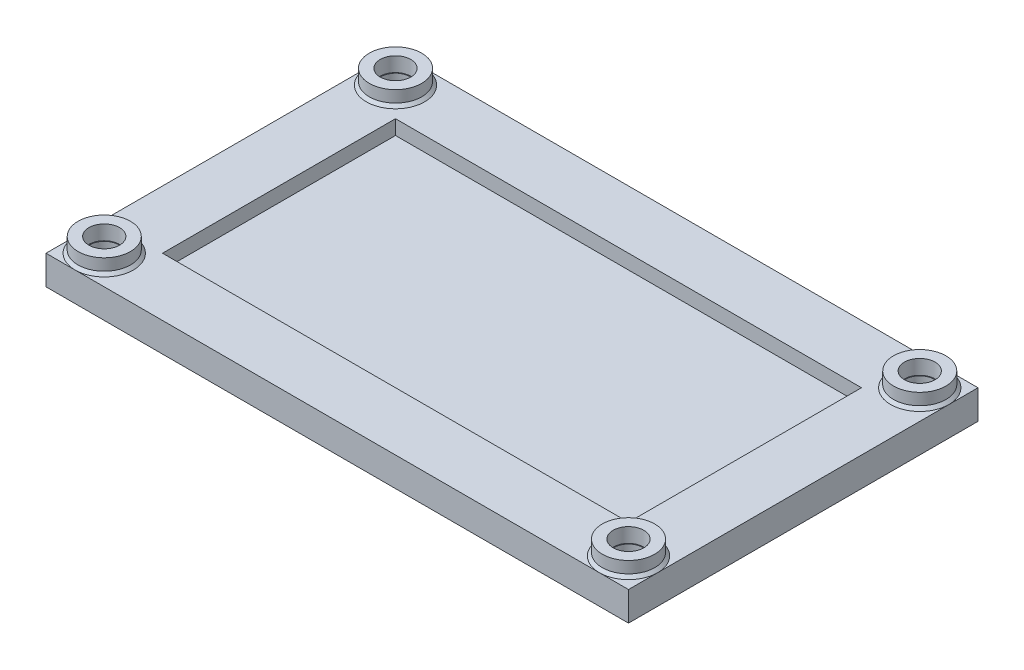
ISO-10303-21;
HEADER;
FILE_DESCRIPTION(('STEP AP214'),'2;1');
FILE_NAME('part.step','',(''),(''),'','','');
FILE_SCHEMA(('AUTOMOTIVE_DESIGN { 1 0 10303 214 1 1 1 1 }'));
ENDSEC;
DATA;
#1=APPLICATION_CONTEXT('core data for automotive mechanical design processes');
#2=APPLICATION_PROTOCOL_DEFINITION('international standard','automotive_design',2000,#1);
#3=PRODUCT_CONTEXT('',#1,'mechanical');
#4=PRODUCT('Part','Part','',(#3));
#5=PRODUCT_RELATED_PRODUCT_CATEGORY('part','',(#4));
#6=PRODUCT_DEFINITION_FORMATION('','',#4);
#7=PRODUCT_DEFINITION_CONTEXT('part definition',#1,'design');
#8=PRODUCT_DEFINITION('design','',#6,#7);
#9=PRODUCT_DEFINITION_SHAPE('','',#8);
#10=(LENGTH_UNIT() NAMED_UNIT(*) SI_UNIT(.MILLI.,.METRE.));
#11=(NAMED_UNIT(*) PLANE_ANGLE_UNIT() SI_UNIT($,.RADIAN.));
#12=(NAMED_UNIT(*) SI_UNIT($,.STERADIAN.) SOLID_ANGLE_UNIT());
#13=UNCERTAINTY_MEASURE_WITH_UNIT(LENGTH_MEASURE(1.E-05),#10,'distance_accuracy_value','');
#14=(GEOMETRIC_REPRESENTATION_CONTEXT(3) GLOBAL_UNCERTAINTY_ASSIGNED_CONTEXT((#13)) GLOBAL_UNIT_ASSIGNED_CONTEXT((#10,
#11,#12)) REPRESENTATION_CONTEXT('',''));
#15=CARTESIAN_POINT('',(0.,0.,0.));
#16=DIRECTION('',(0.,0.,1.));
#17=DIRECTION('',(1.,0.,0.));
#18=AXIS2_PLACEMENT_3D('',#15,#16,#17);
#19=CARTESIAN_POINT('',(0.,10.,0.));
#20=DIRECTION('',(0.,1.,0.));
#21=DIRECTION('',(0.,0.,1.));
#22=AXIS2_PLACEMENT_3D('',#19,#20,#21);
#23=PLANE('',#22);
#24=DIRECTION('',(-1.,0.,0.));
#25=VECTOR('',#24,1.);
#26=CARTESIAN_POINT('',(100.,10.,-60.));
#27=LINE('',#26,#25);
#28=CARTESIAN_POINT('',(100.,10.,-60.));
#29=VERTEX_POINT('',#28);
#30=CARTESIAN_POINT('',(90.,10.,-60.));
#31=VERTEX_POINT('',#30);
#32=EDGE_CURVE('E195',#29,#31,#27,.T.);
#33=ORIENTED_EDGE('',*,*,#32,.T.);
#34=CARTESIAN_POINT('',(90.,10.,-50.));
#35=DIRECTION('',(0.,1.,0.));
#36=DIRECTION('',(0.,0.,1.));
#37=AXIS2_PLACEMENT_3D('',#34,#35,#36);
#38=CIRCLE('',#37,10.);
#39=CARTESIAN_POINT('',(100.,10.,-50.));
#40=VERTEX_POINT('',#39);
#41=EDGE_CURVE('E248',#31,#40,#38,.F.);
#42=ORIENTED_EDGE('',*,*,#41,.T.);
#43=DIRECTION('',(0.,0.,-1.));
#44=VECTOR('',#43,1.);
#45=CARTESIAN_POINT('',(100.,10.,60.));
#46=LINE('',#45,#44);
#47=EDGE_CURVE('E188',#40,#29,#46,.T.);
#48=ORIENTED_EDGE('',*,*,#47,.T.);
#49=EDGE_LOOP('',(#33,#42,#48));
#50=FACE_BOUND('',#49,.T.);
#51=ADVANCED_FACE('F41',(#50),#23,.T.);
#52=DIRECTION('',(0.,0.,1.));
#53=VECTOR('',#52,1.);
#54=CARTESIAN_POINT('',(-100.,10.,60.));
#55=LINE('',#54,#53);
#56=CARTESIAN_POINT('',(-100.,10.,-60.));
#57=VERTEX_POINT('',#56);
#58=CARTESIAN_POINT('',(-100.,10.,-50.));
#59=VERTEX_POINT('',#58);
#60=EDGE_CURVE('E179',#57,#59,#55,.T.);
#61=ORIENTED_EDGE('',*,*,#60,.T.);
#62=CARTESIAN_POINT('',(-90.,10.,-50.));
#63=DIRECTION('',(0.,1.,0.));
#64=DIRECTION('',(0.,0.,1.));
#65=AXIS2_PLACEMENT_3D('',#62,#63,#64);
#66=CIRCLE('',#65,10.);
#67=CARTESIAN_POINT('',(-90.,10.,-60.));
#68=VERTEX_POINT('',#67);
#69=EDGE_CURVE('E245',#59,#68,#66,.F.);
#70=ORIENTED_EDGE('',*,*,#69,.T.);
#71=EDGE_CURVE('E193',#68,#57,#27,.T.);
#72=ORIENTED_EDGE('',*,*,#71,.T.);
#73=EDGE_LOOP('',(#61,#70,#72));
#74=FACE_BOUND('',#73,.T.);
#75=ADVANCED_FACE('F273',(#74),#23,.T.);
#76=DIRECTION('',(1.,0.,0.));
#77=VECTOR('',#76,1.);
#78=CARTESIAN_POINT('',(100.,10.,60.));
#79=LINE('',#78,#77);
#80=CARTESIAN_POINT('',(-100.,10.,60.));
#81=VERTEX_POINT('',#80);
#82=CARTESIAN_POINT('',(-90.,10.,60.));
#83=VERTEX_POINT('',#82);
#84=EDGE_CURVE('E185',#81,#83,#79,.T.);
#85=ORIENTED_EDGE('',*,*,#84,.T.);
#86=CARTESIAN_POINT('',(-90.,10.,50.));
#87=DIRECTION('',(0.,1.,0.));
#88=DIRECTION('',(0.,0.,1.));
#89=AXIS2_PLACEMENT_3D('',#86,#87,#88);
#90=CIRCLE('',#89,10.);
#91=CARTESIAN_POINT('',(-100.,10.,50.));
#92=VERTEX_POINT('',#91);
#93=EDGE_CURVE('E241',#83,#92,#90,.F.);
#94=ORIENTED_EDGE('',*,*,#93,.T.);
#95=EDGE_CURVE('E184',#92,#81,#55,.T.);
#96=ORIENTED_EDGE('',*,*,#95,.T.);
#97=EDGE_LOOP('',(#85,#94,#96));
#98=FACE_BOUND('',#97,.T.);
#99=ADVANCED_FACE('F280',(#98),#23,.T.);
#100=DIRECTION('',(0.,0.,-1.));
#101=VECTOR('',#100,1.);
#102=CARTESIAN_POINT('',(80.,10.,-40.));
#103=LINE('',#102,#101);
#104=CARTESIAN_POINT('',(80.,10.,40.));
#105=VERTEX_POINT('',#104);
#106=CARTESIAN_POINT('',(80.,10.,-40.));
#107=VERTEX_POINT('',#106);
#108=EDGE_CURVE('E139',#105,#107,#103,.T.);
#109=ORIENTED_EDGE('',*,*,#108,.F.);
#110=DIRECTION('',(1.,0.,0.));
#111=VECTOR('',#110,1.);
#112=CARTESIAN_POINT('',(-80.,10.,40.));
#113=LINE('',#112,#111);
#114=CARTESIAN_POINT('',(-80.,10.,40.));
#115=VERTEX_POINT('',#114);
#116=EDGE_CURVE('E156',#115,#105,#113,.T.);
#117=ORIENTED_EDGE('',*,*,#116,.F.);
#118=DIRECTION('',(0.,0.,1.));
#119=VECTOR('',#118,1.);
#120=CARTESIAN_POINT('',(-80.,10.,-40.));
#121=LINE('',#120,#119);
#122=CARTESIAN_POINT('',(-80.,10.,-40.));
#123=VERTEX_POINT('',#122);
#124=EDGE_CURVE('E159',#123,#115,#121,.T.);
#125=ORIENTED_EDGE('',*,*,#124,.F.);
#126=DIRECTION('',(-1.,0.,0.));
#127=VECTOR('',#126,1.);
#128=CARTESIAN_POINT('',(-80.,10.,-40.));
#129=LINE('',#128,#127);
#130=EDGE_CURVE('E168',#107,#123,#129,.T.);
#131=ORIENTED_EDGE('',*,*,#130,.F.);
#132=EDGE_LOOP('',(#109,#117,#125,#131));
#133=FACE_BOUND('',#132,.T.);
#134=CARTESIAN_POINT('',(100.,10.,50.));
#135=VERTEX_POINT('',#134);
#136=EDGE_CURVE('E194',#135,#40,#46,.T.);
#137=ORIENTED_EDGE('',*,*,#136,.T.);
#138=CARTESIAN_POINT('',(90.,10.,-50.));
#139=DIRECTION('',(0.,1.,0.));
#140=DIRECTION('',(0.,0.,1.));
#141=AXIS2_PLACEMENT_3D('',#138,#139,#140);
#142=CIRCLE('',#141,10.);
#143=EDGE_CURVE('E64',#40,#31,#142,.F.);
#144=ORIENTED_EDGE('',*,*,#143,.T.);
#145=EDGE_CURVE('E199',#31,#68,#27,.T.);
#146=ORIENTED_EDGE('',*,*,#145,.T.);
#147=CARTESIAN_POINT('',(-90.,10.,-50.));
#148=DIRECTION('',(0.,1.,0.));
#149=DIRECTION('',(0.,0.,1.));
#150=AXIS2_PLACEMENT_3D('',#147,#148,#149);
#151=CIRCLE('',#150,10.);
#152=EDGE_CURVE('E56',#68,#59,#151,.F.);
#153=ORIENTED_EDGE('',*,*,#152,.T.);
#154=EDGE_CURVE('E183',#59,#92,#55,.T.);
#155=ORIENTED_EDGE('',*,*,#154,.T.);
#156=CARTESIAN_POINT('',(-90.,10.,50.));
#157=DIRECTION('',(0.,1.,0.));
#158=DIRECTION('',(0.,0.,1.));
#159=AXIS2_PLACEMENT_3D('',#156,#157,#158);
#160=CIRCLE('',#159,10.);
#161=EDGE_CURVE('E239',#92,#83,#160,.F.);
#162=ORIENTED_EDGE('',*,*,#161,.T.);
#163=CARTESIAN_POINT('',(90.,10.,60.));
#164=VERTEX_POINT('',#163);
#165=EDGE_CURVE('E189',#83,#164,#79,.T.);
#166=ORIENTED_EDGE('',*,*,#165,.T.);
#167=CARTESIAN_POINT('',(90.,10.,50.));
#168=DIRECTION('',(0.,1.,0.));
#169=DIRECTION('',(0.,0.,1.));
#170=AXIS2_PLACEMENT_3D('',#167,#168,#169);
#171=CIRCLE('',#170,10.);
#172=EDGE_CURVE('E236',#164,#135,#171,.F.);
#173=ORIENTED_EDGE('',*,*,#172,.T.);
#174=EDGE_LOOP('',(#137,#144,#146,#153,#155,#162,#166,#173));
#175=FACE_BOUND('',#174,.T.);
#176=ADVANCED_FACE('F286',(#133,#175),#23,.T.);
#177=CARTESIAN_POINT('',(100.,10.,60.));
#178=VERTEX_POINT('',#177);
#179=EDGE_CURVE('E190',#178,#135,#46,.T.);
#180=ORIENTED_EDGE('',*,*,#179,.T.);
#181=CARTESIAN_POINT('',(90.,10.,50.));
#182=DIRECTION('',(0.,1.,0.));
#183=DIRECTION('',(0.,0.,1.));
#184=AXIS2_PLACEMENT_3D('',#181,#182,#183);
#185=CIRCLE('',#184,10.);
#186=EDGE_CURVE('E234',#135,#164,#185,.F.);
#187=ORIENTED_EDGE('',*,*,#186,.T.);
#188=EDGE_CURVE('E182',#164,#178,#79,.T.);
#189=ORIENTED_EDGE('',*,*,#188,.T.);
#190=EDGE_LOOP('',(#180,#187,#189));
#191=FACE_BOUND('',#190,.T.);
#192=ADVANCED_FACE('F276',(#191),#23,.T.);
#193=CARTESIAN_POINT('',(-90.,10.,-50.));
#194=DIRECTION('',(0.,1.,0.));
#195=DIRECTION('',(0.,0.,1.));
#196=AXIS2_PLACEMENT_3D('',#193,#194,#195);
#197=CIRCLE('',#196,5.00000000000001);
#198=CARTESIAN_POINT('',(-90.,10.,-45.));
#199=VERTEX_POINT('',#198);
#200=EDGE_CURVE('E169',#199,#199,#197,.T.);
#201=ORIENTED_EDGE('',*,*,#200,.F.);
#202=EDGE_LOOP('',(#201));
#203=FACE_BOUND('',#202,.T.);
#204=CARTESIAN_POINT('',(-90.,10.,-50.));
#205=DIRECTION('',(0.,1.,0.));
#206=DIRECTION('',(0.,0.,1.));
#207=AXIS2_PLACEMENT_3D('',#204,#205,#206);
#208=CIRCLE('',#207,5.25);
#209=CARTESIAN_POINT('',(-90.,10.,-44.75));
#210=VERTEX_POINT('',#209);
#211=EDGE_CURVE('E219',#210,#210,#208,.F.);
#212=ORIENTED_EDGE('',*,*,#211,.F.);
#213=EDGE_LOOP('',(#212));
#214=FACE_BOUND('',#213,.T.);
#215=ADVANCED_FACE('F285',(#203,#214),#23,.T.);
#216=CARTESIAN_POINT('',(-90.,5.,-50.));
#217=DIRECTION('',(0.,1.,0.));
#218=DIRECTION('',(0.,0.,1.));
#219=AXIS2_PLACEMENT_3D('',#216,#217,#218);
#220=CYLINDRICAL_SURFACE('',#219,5.00000000000001);
#221=CARTESIAN_POINT('',(-90.,5.,-50.));
#222=DIRECTION('',(0.,1.,0.));
#223=DIRECTION('',(0.,0.,1.));
#224=AXIS2_PLACEMENT_3D('',#221,#222,#223);
#225=CIRCLE('',#224,5.00000000000001);
#226=CARTESIAN_POINT('',(-90.,5.,-45.));
#227=VERTEX_POINT('',#226);
#228=EDGE_CURVE('E399',#227,#227,#225,.T.);
#229=ORIENTED_EDGE('',*,*,#228,.F.);
#230=EDGE_LOOP('',(#229));
#231=FACE_BOUND('',#230,.T.);
#232=ORIENTED_EDGE('',*,*,#200,.T.);
#233=EDGE_LOOP('',(#232));
#234=FACE_BOUND('',#233,.T.);
#235=ADVANCED_FACE('F292',(#231,#234),#220,.F.);
#236=CARTESIAN_POINT('',(-90.,5.,-50.));
#237=DIRECTION('',(0.,1.,0.));
#238=DIRECTION('',(0.,0.,1.));
#239=AXIS2_PLACEMENT_3D('',#236,#237,#238);
#240=PLANE('',#239);
#241=ORIENTED_EDGE('',*,*,#228,.T.);
#242=EDGE_LOOP('',(#241));
#243=FACE_BOUND('',#242,.T.);
#244=ADVANCED_FACE('F540',(#243),#240,.T.);
#245=CARTESIAN_POINT('',(-90.,15.,-50.));
#246=DIRECTION('',(0.,-1.,0.));
#247=DIRECTION('',(0.,0.,-1.));
#248=AXIS2_PLACEMENT_3D('',#245,#246,#247);
#249=CYLINDRICAL_SURFACE('',#248,5.25);
#250=ORIENTED_EDGE('',*,*,#211,.T.);
#251=EDGE_LOOP('',(#250));
#252=FACE_BOUND('',#251,.T.);
#253=CARTESIAN_POINT('',(-90.,15.,-50.));
#254=DIRECTION('',(0.,1.,0.));
#255=DIRECTION('',(0.,0.,1.));
#256=AXIS2_PLACEMENT_3D('',#253,#254,#255);
#257=CIRCLE('',#256,5.25);
#258=CARTESIAN_POINT('',(-90.,15.,-44.75));
#259=VERTEX_POINT('',#258);
#260=EDGE_CURVE('E385',#259,#259,#257,.T.);
#261=ORIENTED_EDGE('',*,*,#260,.T.);
#262=EDGE_LOOP('',(#261));
#263=FACE_BOUND('',#262,.T.);
#264=ADVANCED_FACE('F536',(#252,#263),#249,.F.);
#265=CARTESIAN_POINT('',(-90.,15.,-50.));
#266=DIRECTION('',(0.,-1.,0.));
#267=DIRECTION('',(0.,0.,-1.));
#268=AXIS2_PLACEMENT_3D('',#265,#266,#267);
#269=CYLINDRICAL_SURFACE('',#268,9.00000000000001);
#270=CARTESIAN_POINT('',(-90.,11.,-50.));
#271=DIRECTION('',(0.,1.,0.));
#272=DIRECTION('',(0.,0.,1.));
#273=AXIS2_PLACEMENT_3D('',#270,#271,#272);
#274=CIRCLE('',#273,9.00000000000001);
#275=CARTESIAN_POINT('',(-90.,11.,-41.));
#276=VERTEX_POINT('',#275);
#277=EDGE_CURVE('E251',#276,#276,#274,.T.);
#278=ORIENTED_EDGE('',*,*,#277,.T.);
#279=EDGE_LOOP('',(#278));
#280=FACE_BOUND('',#279,.T.);
#281=CARTESIAN_POINT('',(-90.,15.,-50.));
#282=DIRECTION('',(0.,1.,0.));
#283=DIRECTION('',(0.,0.,1.));
#284=AXIS2_PLACEMENT_3D('',#281,#282,#283);
#285=CIRCLE('',#284,9.00000000000001);
#286=CARTESIAN_POINT('',(-90.,15.,-41.));
#287=VERTEX_POINT('',#286);
#288=EDGE_CURVE('E394',#287,#287,#285,.T.);
#289=ORIENTED_EDGE('',*,*,#288,.F.);
#290=EDGE_LOOP('',(#289));
#291=FACE_BOUND('',#290,.T.);
#292=ADVANCED_FACE('F339',(#280,#291),#269,.T.);
#293=CARTESIAN_POINT('',(0.,15.,0.));
#294=DIRECTION('',(0.,1.,0.));
#295=DIRECTION('',(0.,0.,1.));
#296=AXIS2_PLACEMENT_3D('',#293,#294,#295);
#297=PLANE('',#296);
#298=ORIENTED_EDGE('',*,*,#260,.F.);
#299=EDGE_LOOP('',(#298));
#300=FACE_BOUND('',#299,.T.);
#301=ORIENTED_EDGE('',*,*,#288,.T.);
#302=EDGE_LOOP('',(#301));
#303=FACE_BOUND('',#302,.T.);
#304=ADVANCED_FACE('F333',(#300,#303),#297,.T.);
#305=CARTESIAN_POINT('',(0.,0.,0.));
#306=DIRECTION('',(0.,1.,0.));
#307=DIRECTION('',(0.,0.,1.));
#308=AXIS2_PLACEMENT_3D('',#305,#306,#307);
#309=PLANE('',#308);
#310=DIRECTION('',(0.,0.,1.));
#311=VECTOR('',#310,1.);
#312=CARTESIAN_POINT('',(-100.,0.,60.));
#313=LINE('',#312,#311);
#314=CARTESIAN_POINT('',(-100.,0.,-60.));
#315=VERTEX_POINT('',#314);
#316=CARTESIAN_POINT('',(-100.,0.,60.));
#317=VERTEX_POINT('',#316);
#318=EDGE_CURVE('E175',#315,#317,#313,.T.);
#319=ORIENTED_EDGE('',*,*,#318,.F.);
#320=DIRECTION('',(-1.,0.,0.));
#321=VECTOR('',#320,1.);
#322=CARTESIAN_POINT('',(100.,0.,-60.));
#323=LINE('',#322,#321);
#324=CARTESIAN_POINT('',(100.,0.,-60.));
#325=VERTEX_POINT('',#324);
#326=EDGE_CURVE('E206',#325,#315,#323,.T.);
#327=ORIENTED_EDGE('',*,*,#326,.F.);
#328=DIRECTION('',(0.,0.,-1.));
#329=VECTOR('',#328,1.);
#330=CARTESIAN_POINT('',(100.,0.,60.));
#331=LINE('',#330,#329);
#332=CARTESIAN_POINT('',(100.,0.,60.));
#333=VERTEX_POINT('',#332);
#334=EDGE_CURVE('E204',#333,#325,#331,.T.);
#335=ORIENTED_EDGE('',*,*,#334,.F.);
#336=DIRECTION('',(1.,0.,0.));
#337=VECTOR('',#336,1.);
#338=CARTESIAN_POINT('',(100.,0.,60.));
#339=LINE('',#338,#337);
#340=EDGE_CURVE('E202',#317,#333,#339,.T.);
#341=ORIENTED_EDGE('',*,*,#340,.F.);
#342=EDGE_LOOP('',(#319,#327,#335,#341));
#343=FACE_BOUND('',#342,.T.);
#344=ADVANCED_FACE('F329',(#343),#309,.F.);
#345=CARTESIAN_POINT('',(0.,5.,0.));
#346=DIRECTION('',(0.,1.,0.));
#347=DIRECTION('',(0.,0.,1.));
#348=AXIS2_PLACEMENT_3D('',#345,#346,#347);
#349=PLANE('',#348);
#350=DIRECTION('',(0.,0.,-1.));
#351=VECTOR('',#350,1.);
#352=CARTESIAN_POINT('',(80.,5.,-40.));
#353=LINE('',#352,#351);
#354=CARTESIAN_POINT('',(80.,5.,40.));
#355=VERTEX_POINT('',#354);
#356=CARTESIAN_POINT('',(80.,5.,-40.));
#357=VERTEX_POINT('',#356);
#358=EDGE_CURVE('E136',#355,#357,#353,.T.);
#359=ORIENTED_EDGE('',*,*,#358,.T.);
#360=DIRECTION('',(-1.,0.,0.));
#361=VECTOR('',#360,1.);
#362=CARTESIAN_POINT('',(-80.,5.,-40.));
#363=LINE('',#362,#361);
#364=CARTESIAN_POINT('',(-80.,5.,-40.));
#365=VERTEX_POINT('',#364);
#366=EDGE_CURVE('E147',#357,#365,#363,.T.);
#367=ORIENTED_EDGE('',*,*,#366,.T.);
#368=DIRECTION('',(0.,0.,1.));
#369=VECTOR('',#368,1.);
#370=CARTESIAN_POINT('',(-80.,5.,-40.));
#371=LINE('',#370,#369);
#372=CARTESIAN_POINT('',(-80.,5.,40.));
#373=VERTEX_POINT('',#372);
#374=EDGE_CURVE('E152',#365,#373,#371,.T.);
#375=ORIENTED_EDGE('',*,*,#374,.T.);
#376=DIRECTION('',(1.,0.,0.));
#377=VECTOR('',#376,1.);
#378=CARTESIAN_POINT('',(-80.,5.,40.));
#379=LINE('',#378,#377);
#380=EDGE_CURVE('E144',#373,#355,#379,.T.);
#381=ORIENTED_EDGE('',*,*,#380,.T.);
#382=EDGE_LOOP('',(#359,#367,#375,#381));
#383=FACE_BOUND('',#382,.T.);
#384=ADVANCED_FACE('F154',(#383),#349,.T.);
#385=CARTESIAN_POINT('',(100.,10.,-60.));
#386=DIRECTION('',(0.,0.,1.));
#387=DIRECTION('',(1.,0.,0.));
#388=AXIS2_PLACEMENT_3D('',#385,#386,#387);
#389=PLANE('',#388);
#390=ORIENTED_EDGE('',*,*,#326,.T.);
#391=DIRECTION('',(0.,-1.,0.));
#392=VECTOR('',#391,1.);
#393=CARTESIAN_POINT('',(-100.,10.,-60.));
#394=LINE('',#393,#392);
#395=EDGE_CURVE('E198',#57,#315,#394,.T.);
#396=ORIENTED_EDGE('',*,*,#395,.F.);
#397=ORIENTED_EDGE('',*,*,#71,.F.);
#398=ORIENTED_EDGE('',*,*,#145,.F.);
#399=ORIENTED_EDGE('',*,*,#32,.F.);
#400=DIRECTION('',(0.,-1.,0.));
#401=VECTOR('',#400,1.);
#402=CARTESIAN_POINT('',(100.,10.,-60.));
#403=LINE('',#402,#401);
#404=EDGE_CURVE('E210',#29,#325,#403,.T.);
#405=ORIENTED_EDGE('',*,*,#404,.T.);
#406=EDGE_LOOP('',(#390,#396,#397,#398,#399,#405));
#407=FACE_BOUND('',#406,.T.);
#408=ADVANCED_FACE('F310',(#407),#389,.F.);
#409=CARTESIAN_POINT('',(100.,10.,60.));
#410=DIRECTION('',(-1.,0.,0.));
#411=DIRECTION('',(0.,0.,1.));
#412=AXIS2_PLACEMENT_3D('',#409,#410,#411);
#413=PLANE('',#412);
#414=ORIENTED_EDGE('',*,*,#334,.T.);
#415=ORIENTED_EDGE('',*,*,#404,.F.);
#416=ORIENTED_EDGE('',*,*,#47,.F.);
#417=ORIENTED_EDGE('',*,*,#136,.F.);
#418=ORIENTED_EDGE('',*,*,#179,.F.);
#419=DIRECTION('',(0.,-1.,0.));
#420=VECTOR('',#419,1.);
#421=CARTESIAN_POINT('',(100.,10.,60.));
#422=LINE('',#421,#420);
#423=EDGE_CURVE('E213',#178,#333,#422,.T.);
#424=ORIENTED_EDGE('',*,*,#423,.T.);
#425=EDGE_LOOP('',(#414,#415,#416,#417,#418,#424));
#426=FACE_BOUND('',#425,.T.);
#427=ADVANCED_FACE('F302',(#426),#413,.F.);
#428=CARTESIAN_POINT('',(100.,10.,60.));
#429=DIRECTION('',(0.,0.,-1.));
#430=DIRECTION('',(-1.,0.,0.));
#431=AXIS2_PLACEMENT_3D('',#428,#429,#430);
#432=PLANE('',#431);
#433=ORIENTED_EDGE('',*,*,#340,.T.);
#434=ORIENTED_EDGE('',*,*,#423,.F.);
#435=ORIENTED_EDGE('',*,*,#188,.F.);
#436=ORIENTED_EDGE('',*,*,#165,.F.);
#437=ORIENTED_EDGE('',*,*,#84,.F.);
#438=DIRECTION('',(0.,-1.,0.));
#439=VECTOR('',#438,1.);
#440=CARTESIAN_POINT('',(-100.,10.,60.));
#441=LINE('',#440,#439);
#442=EDGE_CURVE('E216',#81,#317,#441,.T.);
#443=ORIENTED_EDGE('',*,*,#442,.T.);
#444=EDGE_LOOP('',(#433,#434,#435,#436,#437,#443));
#445=FACE_BOUND('',#444,.T.);
#446=ADVANCED_FACE('F326',(#445),#432,.F.);
#447=CARTESIAN_POINT('',(-100.,10.,60.));
#448=DIRECTION('',(1.,0.,0.));
#449=DIRECTION('',(0.,0.,-1.));
#450=AXIS2_PLACEMENT_3D('',#447,#448,#449);
#451=PLANE('',#450);
#452=ORIENTED_EDGE('',*,*,#318,.T.);
#453=ORIENTED_EDGE('',*,*,#442,.F.);
#454=ORIENTED_EDGE('',*,*,#95,.F.);
#455=ORIENTED_EDGE('',*,*,#154,.F.);
#456=ORIENTED_EDGE('',*,*,#60,.F.);
#457=ORIENTED_EDGE('',*,*,#395,.T.);
#458=EDGE_LOOP('',(#452,#453,#454,#455,#456,#457));
#459=FACE_BOUND('',#458,.T.);
#460=ADVANCED_FACE('F317',(#459),#451,.F.);
#461=CARTESIAN_POINT('',(-80.,5.,-40.));
#462=DIRECTION('',(0.,0.,-1.));
#463=DIRECTION('',(-1.,0.,0.));
#464=AXIS2_PLACEMENT_3D('',#461,#462,#463);
#465=PLANE('',#464);
#466=ORIENTED_EDGE('',*,*,#130,.T.);
#467=DIRECTION('',(0.,1.,0.));
#468=VECTOR('',#467,1.);
#469=CARTESIAN_POINT('',(-80.,5.,-40.));
#470=LINE('',#469,#468);
#471=EDGE_CURVE('E143',#365,#123,#470,.T.);
#472=ORIENTED_EDGE('',*,*,#471,.F.);
#473=ORIENTED_EDGE('',*,*,#366,.F.);
#474=DIRECTION('',(0.,1.,0.));
#475=VECTOR('',#474,1.);
#476=CARTESIAN_POINT('',(80.,5.,-40.));
#477=LINE('',#476,#475);
#478=EDGE_CURVE('E132',#357,#107,#477,.T.);
#479=ORIENTED_EDGE('',*,*,#478,.T.);
#480=EDGE_LOOP('',(#466,#472,#473,#479));
#481=FACE_BOUND('',#480,.T.);
#482=ADVANCED_FACE('F148',(#481),#465,.F.);
#483=CARTESIAN_POINT('',(-80.,5.,-40.));
#484=DIRECTION('',(-1.,0.,0.));
#485=DIRECTION('',(0.,0.,1.));
#486=AXIS2_PLACEMENT_3D('',#483,#484,#485);
#487=PLANE('',#486);
#488=ORIENTED_EDGE('',*,*,#124,.T.);
#489=DIRECTION('',(0.,1.,0.));
#490=VECTOR('',#489,1.);
#491=CARTESIAN_POINT('',(-80.,5.,40.));
#492=LINE('',#491,#490);
#493=EDGE_CURVE('E176',#373,#115,#492,.T.);
#494=ORIENTED_EDGE('',*,*,#493,.F.);
#495=ORIENTED_EDGE('',*,*,#374,.F.);
#496=ORIENTED_EDGE('',*,*,#471,.T.);
#497=EDGE_LOOP('',(#488,#494,#495,#496));
#498=FACE_BOUND('',#497,.T.);
#499=ADVANCED_FACE('F439',(#498),#487,.F.);
#500=CARTESIAN_POINT('',(-80.,5.,40.));
#501=DIRECTION('',(0.,0.,1.));
#502=DIRECTION('',(1.,0.,0.));
#503=AXIS2_PLACEMENT_3D('',#500,#501,#502);
#504=PLANE('',#503);
#505=ORIENTED_EDGE('',*,*,#116,.T.);
#506=DIRECTION('',(0.,1.,0.));
#507=VECTOR('',#506,1.);
#508=CARTESIAN_POINT('',(80.,5.,40.));
#509=LINE('',#508,#507);
#510=EDGE_CURVE('E173',#355,#105,#509,.T.);
#511=ORIENTED_EDGE('',*,*,#510,.F.);
#512=ORIENTED_EDGE('',*,*,#380,.F.);
#513=ORIENTED_EDGE('',*,*,#493,.T.);
#514=EDGE_LOOP('',(#505,#511,#512,#513));
#515=FACE_BOUND('',#514,.T.);
#516=ADVANCED_FACE('F436',(#515),#504,.F.);
#517=CARTESIAN_POINT('',(80.,5.,-40.));
#518=DIRECTION('',(1.,0.,0.));
#519=DIRECTION('',(0.,0.,-1.));
#520=AXIS2_PLACEMENT_3D('',#517,#518,#519);
#521=PLANE('',#520);
#522=ORIENTED_EDGE('',*,*,#108,.T.);
#523=ORIENTED_EDGE('',*,*,#478,.F.);
#524=ORIENTED_EDGE('',*,*,#358,.F.);
#525=ORIENTED_EDGE('',*,*,#510,.T.);
#526=EDGE_LOOP('',(#522,#523,#524,#525));
#527=FACE_BOUND('',#526,.T.);
#528=ADVANCED_FACE('F134',(#527),#521,.F.);
#529=CARTESIAN_POINT('',(90.,15.,-50.));
#530=DIRECTION('',(0.,-1.,0.));
#531=DIRECTION('',(0.,0.,-1.));
#532=AXIS2_PLACEMENT_3D('',#529,#530,#531);
#533=CYLINDRICAL_SURFACE('',#532,9.00000000000001);
#534=CARTESIAN_POINT('',(90.,11.,-50.));
#535=DIRECTION('',(0.,1.,0.));
#536=DIRECTION('',(0.,0.,1.));
#537=AXIS2_PLACEMENT_3D('',#534,#535,#536);
#538=CIRCLE('',#537,9.00000000000001);
#539=CARTESIAN_POINT('',(90.,11.,-41.));
#540=VERTEX_POINT('',#539);
#541=EDGE_CURVE('E231',#540,#540,#538,.T.);
#542=ORIENTED_EDGE('',*,*,#541,.T.);
#543=EDGE_LOOP('',(#542));
#544=FACE_BOUND('',#543,.T.);
#545=CARTESIAN_POINT('',(90.,15.,-50.));
#546=DIRECTION('',(0.,1.,0.));
#547=DIRECTION('',(0.,0.,1.));
#548=AXIS2_PLACEMENT_3D('',#545,#546,#547);
#549=CIRCLE('',#548,9.00000000000001);
#550=CARTESIAN_POINT('',(90.,15.,-41.));
#551=VERTEX_POINT('',#550);
#552=EDGE_CURVE('E379',#551,#551,#549,.F.);
#553=ORIENTED_EDGE('',*,*,#552,.T.);
#554=EDGE_LOOP('',(#553));
#555=FACE_BOUND('',#554,.T.);
#556=ADVANCED_FACE('F372',(#544,#555),#533,.T.);
#557=CARTESIAN_POINT('',(90.,15.,-50.));
#558=DIRECTION('',(0.,-1.,0.));
#559=DIRECTION('',(0.,0.,-1.));
#560=AXIS2_PLACEMENT_3D('',#557,#558,#559);
#561=CYLINDRICAL_SURFACE('',#560,5.25);
#562=CARTESIAN_POINT('',(90.,10.,-50.));
#563=DIRECTION('',(0.,1.,0.));
#564=DIRECTION('',(0.,0.,1.));
#565=AXIS2_PLACEMENT_3D('',#562,#563,#564);
#566=CIRCLE('',#565,5.25);
#567=CARTESIAN_POINT('',(90.,10.,-44.75));
#568=VERTEX_POINT('',#567);
#569=EDGE_CURVE('E222',#568,#568,#566,.F.);
#570=ORIENTED_EDGE('',*,*,#569,.T.);
#571=EDGE_LOOP('',(#570));
#572=FACE_BOUND('',#571,.T.);
#573=CARTESIAN_POINT('',(90.,15.,-50.));
#574=DIRECTION('',(0.,1.,0.));
#575=DIRECTION('',(0.,0.,1.));
#576=AXIS2_PLACEMENT_3D('',#573,#574,#575);
#577=CIRCLE('',#576,5.25);
#578=CARTESIAN_POINT('',(90.,15.,-44.75));
#579=VERTEX_POINT('',#578);
#580=EDGE_CURVE('E381',#579,#579,#577,.T.);
#581=ORIENTED_EDGE('',*,*,#580,.T.);
#582=EDGE_LOOP('',(#581));
#583=FACE_BOUND('',#582,.T.);
#584=ADVANCED_FACE('F375',(#572,#583),#561,.F.);
#585=CARTESIAN_POINT('',(0.,15.,0.));
#586=DIRECTION('',(0.,1.,0.));
#587=DIRECTION('',(0.,0.,1.));
#588=AXIS2_PLACEMENT_3D('',#585,#586,#587);
#589=PLANE('',#588);
#590=ORIENTED_EDGE('',*,*,#552,.F.);
#591=EDGE_LOOP('',(#590));
#592=FACE_BOUND('',#591,.T.);
#593=ORIENTED_EDGE('',*,*,#580,.F.);
#594=EDGE_LOOP('',(#593));
#595=FACE_BOUND('',#594,.T.);
#596=ADVANCED_FACE('F462',(#592,#595),#589,.T.);
#597=CARTESIAN_POINT('',(90.,5.,-50.));
#598=DIRECTION('',(0.,1.,0.));
#599=DIRECTION('',(0.,0.,1.));
#600=AXIS2_PLACEMENT_3D('',#597,#598,#599);
#601=PLANE('',#600);
#602=CARTESIAN_POINT('',(90.,5.,-50.));
#603=DIRECTION('',(0.,1.,0.));
#604=DIRECTION('',(0.,0.,1.));
#605=AXIS2_PLACEMENT_3D('',#602,#603,#604);
#606=CIRCLE('',#605,5.00000000000001);
#607=CARTESIAN_POINT('',(90.,5.,-45.));
#608=VERTEX_POINT('',#607);
#609=EDGE_CURVE('E411',#608,#608,#606,.T.);
#610=ORIENTED_EDGE('',*,*,#609,.T.);
#611=EDGE_LOOP('',(#610));
#612=FACE_BOUND('',#611,.T.);
#613=ADVANCED_FACE('F433',(#612),#601,.T.);
#614=CARTESIAN_POINT('',(90.,5.,-50.));
#615=DIRECTION('',(0.,1.,0.));
#616=DIRECTION('',(0.,0.,1.));
#617=AXIS2_PLACEMENT_3D('',#614,#615,#616);
#618=CYLINDRICAL_SURFACE('',#617,5.00000000000001);
#619=ORIENTED_EDGE('',*,*,#609,.F.);
#620=EDGE_LOOP('',(#619));
#621=FACE_BOUND('',#620,.T.);
#622=CARTESIAN_POINT('',(90.,10.,-50.));
#623=DIRECTION('',(0.,1.,0.));
#624=DIRECTION('',(0.,0.,1.));
#625=AXIS2_PLACEMENT_3D('',#622,#623,#624);
#626=CIRCLE('',#625,5.00000000000001);
#627=CARTESIAN_POINT('',(90.,10.,-45.));
#628=VERTEX_POINT('',#627);
#629=EDGE_CURVE('E408',#628,#628,#626,.T.);
#630=ORIENTED_EDGE('',*,*,#629,.T.);
#631=EDGE_LOOP('',(#630));
#632=FACE_BOUND('',#631,.T.);
#633=ADVANCED_FACE('F478',(#621,#632),#618,.F.);
#634=ORIENTED_EDGE('',*,*,#629,.F.);
#635=EDGE_LOOP('',(#634));
#636=FACE_BOUND('',#635,.T.);
#637=ORIENTED_EDGE('',*,*,#569,.F.);
#638=EDGE_LOOP('',(#637));
#639=FACE_BOUND('',#638,.T.);
#640=ADVANCED_FACE('F294',(#636,#639),#23,.T.);
#641=CARTESIAN_POINT('',(90.,15.,50.));
#642=DIRECTION('',(0.,-1.,0.));
#643=DIRECTION('',(0.,0.,-1.));
#644=AXIS2_PLACEMENT_3D('',#641,#642,#643);
#645=CYLINDRICAL_SURFACE('',#644,5.25);
#646=CARTESIAN_POINT('',(90.,10.,50.));
#647=DIRECTION('',(0.,1.,0.));
#648=DIRECTION('',(0.,0.,1.));
#649=AXIS2_PLACEMENT_3D('',#646,#647,#648);
#650=CIRCLE('',#649,5.25);
#651=CARTESIAN_POINT('',(90.,10.,55.25));
#652=VERTEX_POINT('',#651);
#653=EDGE_CURVE('E225',#652,#652,#650,.F.);
#654=ORIENTED_EDGE('',*,*,#653,.T.);
#655=EDGE_LOOP('',(#654));
#656=FACE_BOUND('',#655,.T.);
#657=CARTESIAN_POINT('',(90.,15.,50.));
#658=DIRECTION('',(0.,1.,0.));
#659=DIRECTION('',(0.,0.,1.));
#660=AXIS2_PLACEMENT_3D('',#657,#658,#659);
#661=CIRCLE('',#660,5.25);
#662=CARTESIAN_POINT('',(90.,15.,55.25));
#663=VERTEX_POINT('',#662);
#664=EDGE_CURVE('E388',#663,#663,#661,.T.);
#665=ORIENTED_EDGE('',*,*,#664,.T.);
#666=EDGE_LOOP('',(#665));
#667=FACE_BOUND('',#666,.T.);
#668=ADVANCED_FACE('F491',(#656,#667),#645,.F.);
#669=CARTESIAN_POINT('',(90.,15.,50.));
#670=DIRECTION('',(0.,-1.,0.));
#671=DIRECTION('',(0.,0.,-1.));
#672=AXIS2_PLACEMENT_3D('',#669,#670,#671);
#673=CYLINDRICAL_SURFACE('',#672,9.);
#674=CARTESIAN_POINT('',(90.,11.,50.));
#675=DIRECTION('',(0.,1.,0.));
#676=DIRECTION('',(0.,0.,1.));
#677=AXIS2_PLACEMENT_3D('',#674,#675,#676);
#678=CIRCLE('',#677,9.);
#679=CARTESIAN_POINT('',(90.,11.,59.));
#680=VERTEX_POINT('',#679);
#681=EDGE_CURVE('E11',#680,#680,#678,.T.);
#682=ORIENTED_EDGE('',*,*,#681,.T.);
#683=EDGE_LOOP('',(#682));
#684=FACE_BOUND('',#683,.T.);
#685=CARTESIAN_POINT('',(90.,15.,50.));
#686=DIRECTION('',(0.,1.,0.));
#687=DIRECTION('',(0.,0.,1.));
#688=AXIS2_PLACEMENT_3D('',#685,#686,#687);
#689=CIRCLE('',#688,9.);
#690=CARTESIAN_POINT('',(90.,15.,59.));
#691=VERTEX_POINT('',#690);
#692=EDGE_CURVE('E382',#691,#691,#689,.T.);
#693=ORIENTED_EDGE('',*,*,#692,.F.);
#694=EDGE_LOOP('',(#693));
#695=FACE_BOUND('',#694,.T.);
#696=ADVANCED_FACE('F498',(#684,#695),#673,.T.);
#697=CARTESIAN_POINT('',(0.,15.,0.));
#698=DIRECTION('',(0.,1.,0.));
#699=DIRECTION('',(0.,0.,1.));
#700=AXIS2_PLACEMENT_3D('',#697,#698,#699);
#701=PLANE('',#700);
#702=ORIENTED_EDGE('',*,*,#664,.F.);
#703=EDGE_LOOP('',(#702));
#704=FACE_BOUND('',#703,.T.);
#705=ORIENTED_EDGE('',*,*,#692,.T.);
#706=EDGE_LOOP('',(#705));
#707=FACE_BOUND('',#706,.T.);
#708=ADVANCED_FACE('F430',(#704,#707),#701,.T.);
#709=CARTESIAN_POINT('',(90.,5.,50.));
#710=DIRECTION('',(0.,1.,0.));
#711=DIRECTION('',(0.,0.,1.));
#712=AXIS2_PLACEMENT_3D('',#709,#710,#711);
#713=PLANE('',#712);
#714=CARTESIAN_POINT('',(90.,5.,50.));
#715=DIRECTION('',(0.,1.,0.));
#716=DIRECTION('',(0.,0.,1.));
#717=AXIS2_PLACEMENT_3D('',#714,#715,#716);
#718=CIRCLE('',#717,5.00000000000001);
#719=CARTESIAN_POINT('',(90.,5.,55.));
#720=VERTEX_POINT('',#719);
#721=EDGE_CURVE('E162',#720,#720,#718,.T.);
#722=ORIENTED_EDGE('',*,*,#721,.T.);
#723=EDGE_LOOP('',(#722));
#724=FACE_BOUND('',#723,.T.);
#725=ADVANCED_FACE('F420',(#724),#713,.T.);
#726=CARTESIAN_POINT('',(90.,5.,50.));
#727=DIRECTION('',(0.,1.,0.));
#728=DIRECTION('',(0.,0.,1.));
#729=AXIS2_PLACEMENT_3D('',#726,#727,#728);
#730=CYLINDRICAL_SURFACE('',#729,5.00000000000001);
#731=ORIENTED_EDGE('',*,*,#721,.F.);
#732=EDGE_LOOP('',(#731));
#733=FACE_BOUND('',#732,.T.);
#734=CARTESIAN_POINT('',(90.,10.,50.));
#735=DIRECTION('',(0.,1.,0.));
#736=DIRECTION('',(0.,0.,1.));
#737=AXIS2_PLACEMENT_3D('',#734,#735,#736);
#738=CIRCLE('',#737,5.00000000000001);
#739=CARTESIAN_POINT('',(90.,10.,55.));
#740=VERTEX_POINT('',#739);
#741=EDGE_CURVE('E413',#740,#740,#738,.T.);
#742=ORIENTED_EDGE('',*,*,#741,.T.);
#743=EDGE_LOOP('',(#742));
#744=FACE_BOUND('',#743,.T.);
#745=ADVANCED_FACE('F422',(#733,#744),#730,.F.);
#746=ORIENTED_EDGE('',*,*,#741,.F.);
#747=EDGE_LOOP('',(#746));
#748=FACE_BOUND('',#747,.T.);
#749=ORIENTED_EDGE('',*,*,#653,.F.);
#750=EDGE_LOOP('',(#749));
#751=FACE_BOUND('',#750,.T.);
#752=ADVANCED_FACE('F368',(#748,#751),#23,.T.);
#753=CARTESIAN_POINT('',(-90.,15.,50.));
#754=DIRECTION('',(0.,-1.,0.));
#755=DIRECTION('',(0.,0.,-1.));
#756=AXIS2_PLACEMENT_3D('',#753,#754,#755);
#757=CYLINDRICAL_SURFACE('',#756,9.00000000000001);
#758=CARTESIAN_POINT('',(-90.,11.,50.));
#759=DIRECTION('',(0.,1.,0.));
#760=DIRECTION('',(0.,0.,1.));
#761=AXIS2_PLACEMENT_3D('',#758,#759,#760);
#762=CIRCLE('',#761,9.00000000000001);
#763=CARTESIAN_POINT('',(-90.,11.,59.));
#764=VERTEX_POINT('',#763);
#765=EDGE_CURVE('E50',#764,#764,#762,.T.);
#766=ORIENTED_EDGE('',*,*,#765,.T.);
#767=EDGE_LOOP('',(#766));
#768=FACE_BOUND('',#767,.T.);
#769=CARTESIAN_POINT('',(-90.,15.,50.));
#770=DIRECTION('',(0.,1.,0.));
#771=DIRECTION('',(0.,0.,1.));
#772=AXIS2_PLACEMENT_3D('',#769,#770,#771);
#773=CIRCLE('',#772,9.00000000000001);
#774=CARTESIAN_POINT('',(-90.,15.,59.));
#775=VERTEX_POINT('',#774);
#776=EDGE_CURVE('E845',#775,#775,#773,.F.);
#777=ORIENTED_EDGE('',*,*,#776,.T.);
#778=EDGE_LOOP('',(#777));
#779=FACE_BOUND('',#778,.T.);
#780=ADVANCED_FACE('F256',(#768,#779),#757,.T.);
#781=CARTESIAN_POINT('',(-90.,15.,50.));
#782=DIRECTION('',(0.,-1.,0.));
#783=DIRECTION('',(0.,0.,-1.));
#784=AXIS2_PLACEMENT_3D('',#781,#782,#783);
#785=CYLINDRICAL_SURFACE('',#784,5.25);
#786=CARTESIAN_POINT('',(-90.,10.,50.));
#787=DIRECTION('',(0.,1.,0.));
#788=DIRECTION('',(0.,0.,1.));
#789=AXIS2_PLACEMENT_3D('',#786,#787,#788);
#790=CIRCLE('',#789,5.25);
#791=CARTESIAN_POINT('',(-90.,10.,55.25));
#792=VERTEX_POINT('',#791);
#793=EDGE_CURVE('E228',#792,#792,#790,.F.);
#794=ORIENTED_EDGE('',*,*,#793,.T.);
#795=EDGE_LOOP('',(#794));
#796=FACE_BOUND('',#795,.T.);
#797=CARTESIAN_POINT('',(-90.,15.,50.));
#798=DIRECTION('',(0.,1.,0.));
#799=DIRECTION('',(0.,0.,1.));
#800=AXIS2_PLACEMENT_3D('',#797,#798,#799);
#801=CIRCLE('',#800,5.25);
#802=CARTESIAN_POINT('',(-90.,15.,55.25));
#803=VERTEX_POINT('',#802);
#804=EDGE_CURVE('E848',#803,#803,#801,.T.);
#805=ORIENTED_EDGE('',*,*,#804,.T.);
#806=EDGE_LOOP('',(#805));
#807=FACE_BOUND('',#806,.T.);
#808=ADVANCED_FACE('F742',(#796,#807),#785,.F.);
#809=CARTESIAN_POINT('',(0.,15.,0.));
#810=DIRECTION('',(0.,1.,0.));
#811=DIRECTION('',(0.,0.,1.));
#812=AXIS2_PLACEMENT_3D('',#809,#810,#811);
#813=PLANE('',#812);
#814=ORIENTED_EDGE('',*,*,#776,.F.);
#815=EDGE_LOOP('',(#814));
#816=FACE_BOUND('',#815,.T.);
#817=ORIENTED_EDGE('',*,*,#804,.F.);
#818=EDGE_LOOP('',(#817));
#819=FACE_BOUND('',#818,.T.);
#820=ADVANCED_FACE('F667',(#816,#819),#813,.T.);
#821=CARTESIAN_POINT('',(-90.,5.,50.));
#822=DIRECTION('',(0.,1.,0.));
#823=DIRECTION('',(0.,0.,1.));
#824=AXIS2_PLACEMENT_3D('',#821,#822,#823);
#825=PLANE('',#824);
#826=CARTESIAN_POINT('',(-90.,5.,50.));
#827=DIRECTION('',(0.,1.,0.));
#828=DIRECTION('',(0.,0.,1.));
#829=AXIS2_PLACEMENT_3D('',#826,#827,#828);
#830=CIRCLE('',#829,5.00000000000001);
#831=CARTESIAN_POINT('',(-90.,5.,55.));
#832=VERTEX_POINT('',#831);
#833=EDGE_CURVE('E405',#832,#832,#830,.T.);
#834=ORIENTED_EDGE('',*,*,#833,.T.);
#835=EDGE_LOOP('',(#834));
#836=FACE_BOUND('',#835,.T.);
#837=ADVANCED_FACE('F657',(#836),#825,.T.);
#838=CARTESIAN_POINT('',(-90.,5.,50.));
#839=DIRECTION('',(0.,1.,0.));
#840=DIRECTION('',(0.,0.,1.));
#841=AXIS2_PLACEMENT_3D('',#838,#839,#840);
#842=CYLINDRICAL_SURFACE('',#841,5.00000000000001);
#843=ORIENTED_EDGE('',*,*,#833,.F.);
#844=EDGE_LOOP('',(#843));
#845=FACE_BOUND('',#844,.T.);
#846=CARTESIAN_POINT('',(-90.,10.,50.));
#847=DIRECTION('',(0.,1.,0.));
#848=DIRECTION('',(0.,0.,1.));
#849=AXIS2_PLACEMENT_3D('',#846,#847,#848);
#850=CIRCLE('',#849,5.00000000000001);
#851=CARTESIAN_POINT('',(-90.,10.,55.));
#852=VERTEX_POINT('',#851);
#853=EDGE_CURVE('E402',#852,#852,#850,.T.);
#854=ORIENTED_EDGE('',*,*,#853,.T.);
#855=EDGE_LOOP('',(#854));
#856=FACE_BOUND('',#855,.T.);
#857=ADVANCED_FACE('F366',(#845,#856),#842,.F.);
#858=ORIENTED_EDGE('',*,*,#853,.F.);
#859=EDGE_LOOP('',(#858));
#860=FACE_BOUND('',#859,.T.);
#861=ORIENTED_EDGE('',*,*,#793,.F.);
#862=EDGE_LOOP('',(#861));
#863=FACE_BOUND('',#862,.T.);
#864=ADVANCED_FACE('F296',(#860,#863),#23,.T.);
#865=CARTESIAN_POINT('',(90.,11.,-50.));
#866=DIRECTION('',(0.,-1.,0.));
#867=DIRECTION('',(0.,0.,-1.));
#868=AXIS2_PLACEMENT_3D('',#865,#866,#867);
#869=CONICAL_SURFACE('',#868,9.00000000000001,0.785398163397439);
#870=ORIENTED_EDGE('',*,*,#143,.F.);
#871=ORIENTED_EDGE('',*,*,#41,.F.);
#872=EDGE_LOOP('',(#870,#871));
#873=FACE_BOUND('',#872,.T.);
#874=ORIENTED_EDGE('',*,*,#541,.F.);
#875=EDGE_LOOP('',(#874));
#876=FACE_BOUND('',#875,.T.);
#877=ADVANCED_FACE('F268',(#873,#876),#869,.T.);
#878=CARTESIAN_POINT('',(-90.,10.,-50.));
#879=DIRECTION('',(0.,-1.,0.));
#880=DIRECTION('',(0.,0.,-1.));
#881=AXIS2_PLACEMENT_3D('',#878,#879,#880);
#882=CONICAL_SURFACE('',#881,10.,0.785398163397453);
#883=ORIENTED_EDGE('',*,*,#277,.F.);
#884=EDGE_LOOP('',(#883));
#885=FACE_BOUND('',#884,.T.);
#886=ORIENTED_EDGE('',*,*,#152,.F.);
#887=ORIENTED_EDGE('',*,*,#69,.F.);
#888=EDGE_LOOP('',(#886,#887));
#889=FACE_BOUND('',#888,.T.);
#890=ADVANCED_FACE('F261',(#885,#889),#882,.T.);
#891=CARTESIAN_POINT('',(-90.,11.,50.));
#892=DIRECTION('',(0.,-1.,0.));
#893=DIRECTION('',(0.,0.,-1.));
#894=AXIS2_PLACEMENT_3D('',#891,#892,#893);
#895=CONICAL_SURFACE('',#894,9.00000000000001,0.785398163397439);
#896=ORIENTED_EDGE('',*,*,#161,.F.);
#897=ORIENTED_EDGE('',*,*,#93,.F.);
#898=EDGE_LOOP('',(#896,#897));
#899=FACE_BOUND('',#898,.T.);
#900=ORIENTED_EDGE('',*,*,#765,.F.);
#901=EDGE_LOOP('',(#900));
#902=FACE_BOUND('',#901,.T.);
#903=ADVANCED_FACE('F259',(#899,#902),#895,.T.);
#904=CARTESIAN_POINT('',(90.,10.,50.));
#905=DIRECTION('',(0.,-1.,0.));
#906=DIRECTION('',(0.,0.,-1.));
#907=AXIS2_PLACEMENT_3D('',#904,#905,#906);
#908=CONICAL_SURFACE('',#907,10.,0.785398163397454);
#909=ORIENTED_EDGE('',*,*,#681,.F.);
#910=EDGE_LOOP('',(#909));
#911=FACE_BOUND('',#910,.T.);
#912=ORIENTED_EDGE('',*,*,#186,.F.);
#913=ORIENTED_EDGE('',*,*,#172,.F.);
#914=EDGE_LOOP('',(#912,#913));
#915=FACE_BOUND('',#914,.T.);
#916=ADVANCED_FACE('F44',(#911,#915),#908,.T.);
#917=CLOSED_SHELL('',(#51,#75,#99,#176,#192,#215,#235,#244,#264,#292,#304,#344,#384,#408,#427,
#446,#460,#482,#499,#516,#528,#556,#584,#596,#613,#633,#640,#668,#696,#708,#725,#745,#752,#780,
#808,#820,#837,#857,#864,#877,#890,#903,#916));
#918=MANIFOLD_SOLID_BREP('B2',#917);
#919=ADVANCED_BREP_SHAPE_REPRESENTATION('',(#18,#918),#14);
#920=SHAPE_DEFINITION_REPRESENTATION(#9,#919);
ENDSEC;
END-ISO-10303-21;
